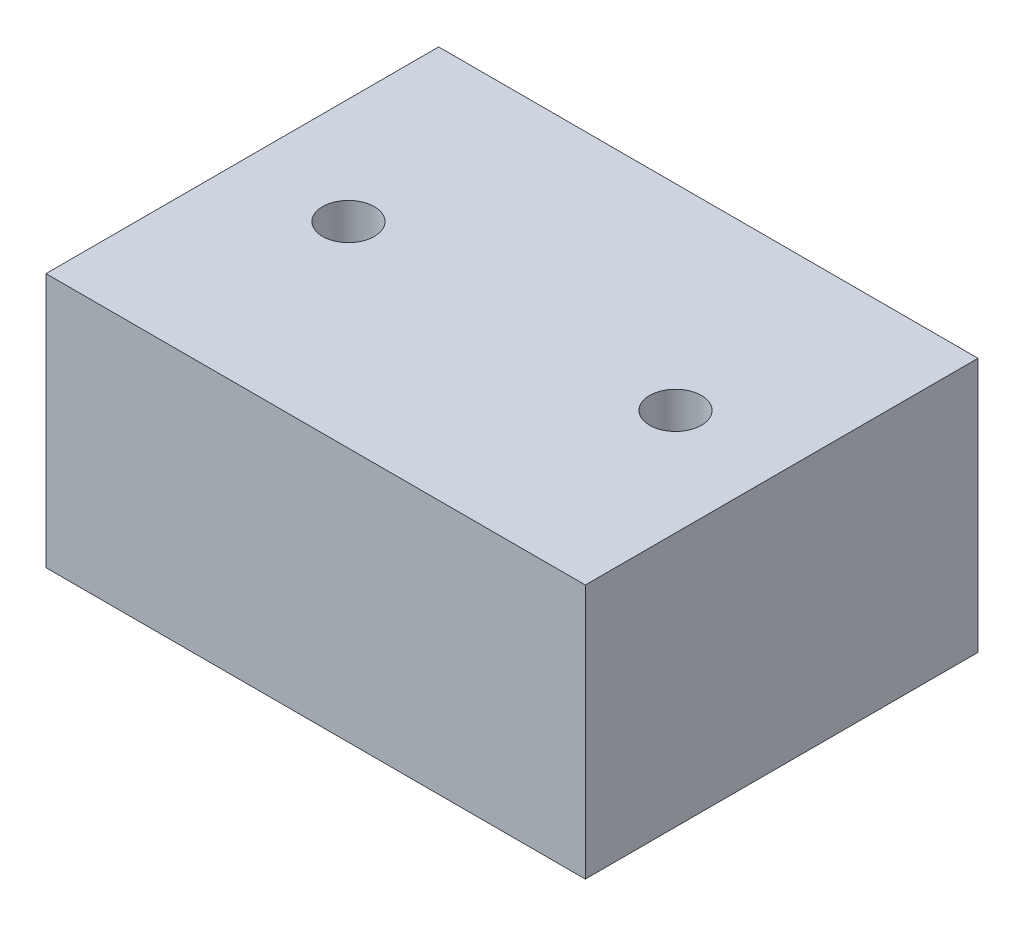
ISO-10303-21;
HEADER;
FILE_DESCRIPTION(('STEP AP214'),'2;1');
FILE_NAME('part.step','',(''),(''),'','','');
FILE_SCHEMA(('AUTOMOTIVE_DESIGN { 1 0 10303 214 1 1 1 1 }'));
ENDSEC;
DATA;
#1=APPLICATION_CONTEXT('core data for automotive mechanical design processes');
#2=APPLICATION_PROTOCOL_DEFINITION('international standard','automotive_design',2000,#1);
#3=PRODUCT_CONTEXT('',#1,'mechanical');
#4=PRODUCT('Part','Part','',(#3));
#5=PRODUCT_RELATED_PRODUCT_CATEGORY('part','',(#4));
#6=PRODUCT_DEFINITION_FORMATION('','',#4);
#7=PRODUCT_DEFINITION_CONTEXT('part definition',#1,'design');
#8=PRODUCT_DEFINITION('design','',#6,#7);
#9=PRODUCT_DEFINITION_SHAPE('','',#8);
#10=(LENGTH_UNIT() NAMED_UNIT(*) SI_UNIT(.MILLI.,.METRE.));
#11=(NAMED_UNIT(*) PLANE_ANGLE_UNIT() SI_UNIT($,.RADIAN.));
#12=(NAMED_UNIT(*) SI_UNIT($,.STERADIAN.) SOLID_ANGLE_UNIT());
#13=UNCERTAINTY_MEASURE_WITH_UNIT(LENGTH_MEASURE(1.E-05),#10,'distance_accuracy_value','');
#14=(GEOMETRIC_REPRESENTATION_CONTEXT(3) GLOBAL_UNCERTAINTY_ASSIGNED_CONTEXT((#13)) GLOBAL_UNIT_ASSIGNED_CONTEXT((#10,
#11,#12)) REPRESENTATION_CONTEXT('',''));
#15=CARTESIAN_POINT('',(0.,0.,0.));
#16=DIRECTION('',(0.,0.,1.));
#17=DIRECTION('',(1.,0.,0.));
#18=AXIS2_PLACEMENT_3D('',#15,#16,#17);
#19=CARTESIAN_POINT('',(0.,12.,0.));
#20=DIRECTION('',(1.,0.,0.));
#21=DIRECTION('',(0.,0.,-1.));
#22=AXIS2_PLACEMENT_3D('',#19,#20,#21);
#23=PLANE('',#22);
#24=DIRECTION('',(0.,0.,1.));
#25=VECTOR('',#24,1.);
#26=CARTESIAN_POINT('',(0.,0.,0.));
#27=LINE('',#26,#25);
#28=CARTESIAN_POINT('',(0.,0.,-18.5));
#29=VERTEX_POINT('',#28);
#30=CARTESIAN_POINT('',(0.,0.,0.));
#31=VERTEX_POINT('',#30);
#32=EDGE_CURVE('E149',#29,#31,#27,.T.);
#33=ORIENTED_EDGE('',*,*,#32,.T.);
#34=DIRECTION('',(0.,-1.,0.));
#35=VECTOR('',#34,1.);
#36=CARTESIAN_POINT('',(0.,12.,0.));
#37=LINE('',#36,#35);
#38=CARTESIAN_POINT('',(0.,12.,0.));
#39=VERTEX_POINT('',#38);
#40=EDGE_CURVE('E11',#39,#31,#37,.T.);
#41=ORIENTED_EDGE('',*,*,#40,.F.);
#42=DIRECTION('',(0.,0.,1.));
#43=VECTOR('',#42,1.);
#44=CARTESIAN_POINT('',(0.,12.,0.));
#45=LINE('',#44,#43);
#46=CARTESIAN_POINT('',(0.,12.,-18.5));
#47=VERTEX_POINT('',#46);
#48=EDGE_CURVE('E150',#47,#39,#45,.T.);
#49=ORIENTED_EDGE('',*,*,#48,.F.);
#50=DIRECTION('',(0.,-1.,0.));
#51=VECTOR('',#50,1.);
#52=CARTESIAN_POINT('',(0.,12.,-18.5));
#53=LINE('',#52,#51);
#54=EDGE_CURVE('E160',#47,#29,#53,.T.);
#55=ORIENTED_EDGE('',*,*,#54,.T.);
#56=EDGE_LOOP('',(#33,#41,#49,#55));
#57=FACE_BOUND('',#56,.T.);
#58=ADVANCED_FACE('F45',(#57),#23,.F.);
#59=CARTESIAN_POINT('',(0.,12.,0.));
#60=DIRECTION('',(0.,0.,-1.));
#61=DIRECTION('',(-1.,0.,0.));
#62=AXIS2_PLACEMENT_3D('',#59,#60,#61);
#63=PLANE('',#62);
#64=DIRECTION('',(1.,0.,0.));
#65=VECTOR('',#64,1.);
#66=CARTESIAN_POINT('',(0.,0.,0.));
#67=LINE('',#66,#65);
#68=CARTESIAN_POINT('',(25.41,0.,0.));
#69=VERTEX_POINT('',#68);
#70=EDGE_CURVE('E164',#31,#69,#67,.T.);
#71=ORIENTED_EDGE('',*,*,#70,.T.);
#72=DIRECTION('',(0.,-1.,0.));
#73=VECTOR('',#72,1.);
#74=CARTESIAN_POINT('',(25.41,12.,0.));
#75=LINE('',#74,#73);
#76=CARTESIAN_POINT('',(25.41,12.,0.));
#77=VERTEX_POINT('',#76);
#78=EDGE_CURVE('E54',#77,#69,#75,.T.);
#79=ORIENTED_EDGE('',*,*,#78,.F.);
#80=DIRECTION('',(1.,0.,0.));
#81=VECTOR('',#80,1.);
#82=CARTESIAN_POINT('',(0.,12.,0.));
#83=LINE('',#82,#81);
#84=EDGE_CURVE('E93',#39,#77,#83,.T.);
#85=ORIENTED_EDGE('',*,*,#84,.F.);
#86=ORIENTED_EDGE('',*,*,#40,.T.);
#87=EDGE_LOOP('',(#71,#79,#85,#86));
#88=FACE_BOUND('',#87,.T.);
#89=ADVANCED_FACE('F194',(#88),#63,.F.);
#90=CARTESIAN_POINT('',(25.41,12.,0.));
#91=DIRECTION('',(-1.,0.,0.));
#92=DIRECTION('',(0.,0.,1.));
#93=AXIS2_PLACEMENT_3D('',#90,#91,#92);
#94=PLANE('',#93);
#95=DIRECTION('',(0.,0.,-1.));
#96=VECTOR('',#95,1.);
#97=CARTESIAN_POINT('',(25.41,0.,0.));
#98=LINE('',#97,#96);
#99=CARTESIAN_POINT('',(25.41,0.,-18.5));
#100=VERTEX_POINT('',#99);
#101=EDGE_CURVE('E80',#69,#100,#98,.T.);
#102=ORIENTED_EDGE('',*,*,#101,.T.);
#103=DIRECTION('',(0.,-1.,0.));
#104=VECTOR('',#103,1.);
#105=CARTESIAN_POINT('',(25.41,12.,-18.5));
#106=LINE('',#105,#104);
#107=CARTESIAN_POINT('',(25.41,12.,-18.5));
#108=VERTEX_POINT('',#107);
#109=EDGE_CURVE('E173',#108,#100,#106,.T.);
#110=ORIENTED_EDGE('',*,*,#109,.F.);
#111=DIRECTION('',(0.,0.,-1.));
#112=VECTOR('',#111,1.);
#113=CARTESIAN_POINT('',(25.41,12.,0.));
#114=LINE('',#113,#112);
#115=EDGE_CURVE('E155',#77,#108,#114,.T.);
#116=ORIENTED_EDGE('',*,*,#115,.F.);
#117=ORIENTED_EDGE('',*,*,#78,.T.);
#118=EDGE_LOOP('',(#102,#110,#116,#117));
#119=FACE_BOUND('',#118,.T.);
#120=ADVANCED_FACE('F177',(#119),#94,.F.);
#121=CARTESIAN_POINT('',(0.,12.,-18.5));
#122=DIRECTION('',(0.,0.,1.));
#123=DIRECTION('',(1.,0.,0.));
#124=AXIS2_PLACEMENT_3D('',#121,#122,#123);
#125=PLANE('',#124);
#126=DIRECTION('',(-1.,0.,0.));
#127=VECTOR('',#126,1.);
#128=CARTESIAN_POINT('',(0.,0.,-18.5));
#129=LINE('',#128,#127);
#130=EDGE_CURVE('E86',#100,#29,#129,.T.);
#131=ORIENTED_EDGE('',*,*,#130,.T.);
#132=ORIENTED_EDGE('',*,*,#54,.F.);
#133=DIRECTION('',(-1.,0.,0.));
#134=VECTOR('',#133,1.);
#135=CARTESIAN_POINT('',(0.,12.,-18.5));
#136=LINE('',#135,#134);
#137=EDGE_CURVE('E62',#108,#47,#136,.T.);
#138=ORIENTED_EDGE('',*,*,#137,.F.);
#139=ORIENTED_EDGE('',*,*,#109,.T.);
#140=EDGE_LOOP('',(#131,#132,#138,#139));
#141=FACE_BOUND('',#140,.T.);
#142=ADVANCED_FACE('F184',(#141),#125,.F.);
#143=CARTESIAN_POINT('',(0.,12.,0.));
#144=DIRECTION('',(0.,-1.,0.));
#145=DIRECTION('',(0.,0.,-1.));
#146=AXIS2_PLACEMENT_3D('',#143,#144,#145);
#147=PLANE('',#146);
#148=CARTESIAN_POINT('',(20.41,12.,-9.25));
#149=DIRECTION('',(0.,-1.,0.));
#150=DIRECTION('',(0.,0.,-1.));
#151=AXIS2_PLACEMENT_3D('',#148,#149,#150);
#152=CIRCLE('',#151,1.2192);
#153=CARTESIAN_POINT('',(20.41,12.,-10.4692));
#154=VERTEX_POINT('',#153);
#155=EDGE_CURVE('E408',#154,#154,#152,.T.);
#156=ORIENTED_EDGE('',*,*,#155,.T.);
#157=EDGE_LOOP('',(#156));
#158=FACE_BOUND('',#157,.T.);
#159=CARTESIAN_POINT('',(5.,12.,-9.25));
#160=DIRECTION('',(0.,-1.,0.));
#161=DIRECTION('',(0.,0.,-1.));
#162=AXIS2_PLACEMENT_3D('',#159,#160,#161);
#163=CIRCLE('',#162,1.2192);
#164=CARTESIAN_POINT('',(5.,12.,-10.4692));
#165=VERTEX_POINT('',#164);
#166=EDGE_CURVE('E424',#165,#165,#163,.T.);
#167=ORIENTED_EDGE('',*,*,#166,.T.);
#168=EDGE_LOOP('',(#167));
#169=FACE_BOUND('',#168,.T.);
#170=ORIENTED_EDGE('',*,*,#48,.T.);
#171=ORIENTED_EDGE('',*,*,#84,.T.);
#172=ORIENTED_EDGE('',*,*,#115,.T.);
#173=ORIENTED_EDGE('',*,*,#137,.T.);
#174=EDGE_LOOP('',(#170,#171,#172,#173));
#175=FACE_BOUND('',#174,.T.);
#176=ADVANCED_FACE('F186',(#158,#169,#175),#147,.F.);
#177=CARTESIAN_POINT('',(0.,0.,0.));
#178=DIRECTION('',(0.,-1.,0.));
#179=DIRECTION('',(0.,0.,-1.));
#180=AXIS2_PLACEMENT_3D('',#177,#178,#179);
#181=PLANE('',#180);
#182=CARTESIAN_POINT('',(20.41,0.,-9.25));
#183=DIRECTION('',(0.,-1.,0.));
#184=DIRECTION('',(0.,0.,-1.));
#185=AXIS2_PLACEMENT_3D('',#182,#183,#184);
#186=CIRCLE('',#185,2.77875999999999);
#187=CARTESIAN_POINT('',(20.41,0.,-12.02876));
#188=VERTEX_POINT('',#187);
#189=EDGE_CURVE('E398',#188,#188,#186,.T.);
#190=ORIENTED_EDGE('',*,*,#189,.F.);
#191=EDGE_LOOP('',(#190));
#192=FACE_BOUND('',#191,.T.);
#193=CARTESIAN_POINT('',(5.,0.,-9.25));
#194=DIRECTION('',(0.,-1.,0.));
#195=DIRECTION('',(0.,0.,-1.));
#196=AXIS2_PLACEMENT_3D('',#193,#194,#195);
#197=CIRCLE('',#196,2.77875999999999);
#198=CARTESIAN_POINT('',(5.,0.,-12.02876));
#199=VERTEX_POINT('',#198);
#200=EDGE_CURVE('E412',#199,#199,#197,.T.);
#201=ORIENTED_EDGE('',*,*,#200,.F.);
#202=EDGE_LOOP('',(#201));
#203=FACE_BOUND('',#202,.T.);
#204=CARTESIAN_POINT('',(12.705,0.,-9.25));
#205=DIRECTION('',(0.,-1.,0.));
#206=DIRECTION('',(0.,0.,-1.));
#207=AXIS2_PLACEMENT_3D('',#204,#205,#206);
#208=CIRCLE('',#207,3.);
#209=CARTESIAN_POINT('',(12.705,0.,-12.25));
#210=VERTEX_POINT('',#209);
#211=EDGE_CURVE('E428',#210,#210,#208,.T.);
#212=ORIENTED_EDGE('',*,*,#211,.F.);
#213=EDGE_LOOP('',(#212));
#214=FACE_BOUND('',#213,.T.);
#215=CARTESIAN_POINT('',(23.91,0.,-17.));
#216=DIRECTION('',(0.,-1.,0.));
#217=DIRECTION('',(0.,0.,-1.));
#218=AXIS2_PLACEMENT_3D('',#215,#216,#217);
#219=CIRCLE('',#218,0.88899999999999);
#220=CARTESIAN_POINT('',(23.91,0.,-17.889));
#221=VERTEX_POINT('',#220);
#222=EDGE_CURVE('E118',#221,#221,#219,.T.);
#223=ORIENTED_EDGE('',*,*,#222,.F.);
#224=EDGE_LOOP('',(#223));
#225=FACE_BOUND('',#224,.T.);
#226=CARTESIAN_POINT('',(23.91,0.,-1.5));
#227=DIRECTION('',(0.,-1.,0.));
#228=DIRECTION('',(0.,0.,-1.));
#229=AXIS2_PLACEMENT_3D('',#226,#227,#228);
#230=CIRCLE('',#229,0.88899999999999);
#231=CARTESIAN_POINT('',(23.91,0.,-2.38899999999999));
#232=VERTEX_POINT('',#231);
#233=EDGE_CURVE('E117',#232,#232,#230,.T.);
#234=ORIENTED_EDGE('',*,*,#233,.F.);
#235=EDGE_LOOP('',(#234));
#236=FACE_BOUND('',#235,.T.);
#237=CARTESIAN_POINT('',(1.5,0.,-1.5));
#238=DIRECTION('',(0.,-1.,0.));
#239=DIRECTION('',(0.,0.,-1.));
#240=AXIS2_PLACEMENT_3D('',#237,#238,#239);
#241=CIRCLE('',#240,0.888999999999989);
#242=CARTESIAN_POINT('',(1.5,0.,-2.38899999999999));
#243=VERTEX_POINT('',#242);
#244=EDGE_CURVE('E133',#243,#243,#241,.T.);
#245=ORIENTED_EDGE('',*,*,#244,.F.);
#246=EDGE_LOOP('',(#245));
#247=FACE_BOUND('',#246,.T.);
#248=CARTESIAN_POINT('',(1.5,0.,-17.));
#249=DIRECTION('',(0.,-1.,0.));
#250=DIRECTION('',(0.,0.,-1.));
#251=AXIS2_PLACEMENT_3D('',#248,#249,#250);
#252=CIRCLE('',#251,0.888999999999989);
#253=CARTESIAN_POINT('',(1.5,0.,-17.889));
#254=VERTEX_POINT('',#253);
#255=EDGE_CURVE('E141',#254,#254,#252,.T.);
#256=ORIENTED_EDGE('',*,*,#255,.F.);
#257=EDGE_LOOP('',(#256));
#258=FACE_BOUND('',#257,.T.);
#259=ORIENTED_EDGE('',*,*,#32,.F.);
#260=ORIENTED_EDGE('',*,*,#130,.F.);
#261=ORIENTED_EDGE('',*,*,#101,.F.);
#262=ORIENTED_EDGE('',*,*,#70,.F.);
#263=EDGE_LOOP('',(#259,#260,#261,#262));
#264=FACE_BOUND('',#263,.T.);
#265=ADVANCED_FACE('F180',(#192,#203,#214,#225,#236,#247,#258,#264),#181,.T.);
#266=CARTESIAN_POINT('',(1.5,7.4658349096845,-17.));
#267=DIRECTION('',(0.,-1.,0.));
#268=DIRECTION('',(0.,0.,-1.));
#269=AXIS2_PLACEMENT_3D('',#266,#267,#268);
#270=CONICAL_SURFACE('',#269,0.888999999999999,1.02974425867665);
#271=CARTESIAN_POINT('',(1.5,8.,-17.));
#272=VERTEX_POINT('',#271);
#273=VERTEX_LOOP('',#272);
#274=FACE_BOUND('',#273,.T.);
#275=CARTESIAN_POINT('',(1.5,7.4658349096845,-17.));
#276=DIRECTION('',(0.,-1.,0.));
#277=DIRECTION('',(0.,0.,-1.));
#278=AXIS2_PLACEMENT_3D('',#275,#276,#277);
#279=CIRCLE('',#278,0.888999999999999);
#280=CARTESIAN_POINT('',(1.5,7.4658349096845,-17.889));
#281=VERTEX_POINT('',#280);
#282=EDGE_CURVE('E145',#281,#281,#279,.T.);
#283=ORIENTED_EDGE('',*,*,#282,.T.);
#284=EDGE_LOOP('',(#283));
#285=FACE_BOUND('',#284,.T.);
#286=ADVANCED_FACE('F217',(#274,#285),#270,.F.);
#287=CARTESIAN_POINT('',(1.5,0.,-17.));
#288=DIRECTION('',(0.,-1.,0.));
#289=DIRECTION('',(0.,0.,-1.));
#290=AXIS2_PLACEMENT_3D('',#287,#288,#289);
#291=CYLINDRICAL_SURFACE('',#290,0.888999999999994);
#292=ORIENTED_EDGE('',*,*,#282,.F.);
#293=EDGE_LOOP('',(#292));
#294=FACE_BOUND('',#293,.T.);
#295=ORIENTED_EDGE('',*,*,#255,.T.);
#296=EDGE_LOOP('',(#295));
#297=FACE_BOUND('',#296,.T.);
#298=ADVANCED_FACE('F222',(#294,#297),#291,.F.);
#299=CARTESIAN_POINT('',(1.5,7.4658349096845,-1.5));
#300=DIRECTION('',(0.,-1.,0.));
#301=DIRECTION('',(0.,0.,-1.));
#302=AXIS2_PLACEMENT_3D('',#299,#300,#301);
#303=CONICAL_SURFACE('',#302,0.888999999999998,1.02974425867665);
#304=CARTESIAN_POINT('',(1.5,8.,-1.5));
#305=VERTEX_POINT('',#304);
#306=VERTEX_LOOP('',#305);
#307=FACE_BOUND('',#306,.T.);
#308=CARTESIAN_POINT('',(1.5,7.4658349096845,-1.5));
#309=DIRECTION('',(0.,-1.,0.));
#310=DIRECTION('',(0.,0.,-1.));
#311=AXIS2_PLACEMENT_3D('',#308,#309,#310);
#312=CIRCLE('',#311,0.888999999999998);
#313=CARTESIAN_POINT('',(1.5,7.4658349096845,-2.389));
#314=VERTEX_POINT('',#313);
#315=EDGE_CURVE('E137',#314,#314,#312,.T.);
#316=ORIENTED_EDGE('',*,*,#315,.T.);
#317=EDGE_LOOP('',(#316));
#318=FACE_BOUND('',#317,.T.);
#319=ADVANCED_FACE('F235',(#307,#318),#303,.F.);
#320=CARTESIAN_POINT('',(1.5,0.,-1.5));
#321=DIRECTION('',(0.,-1.,0.));
#322=DIRECTION('',(0.,0.,-1.));
#323=AXIS2_PLACEMENT_3D('',#320,#321,#322);
#324=CYLINDRICAL_SURFACE('',#323,0.888999999999994);
#325=ORIENTED_EDGE('',*,*,#315,.F.);
#326=EDGE_LOOP('',(#325));
#327=FACE_BOUND('',#326,.T.);
#328=ORIENTED_EDGE('',*,*,#244,.T.);
#329=EDGE_LOOP('',(#328));
#330=FACE_BOUND('',#329,.T.);
#331=ADVANCED_FACE('F247',(#327,#330),#324,.F.);
#332=CARTESIAN_POINT('',(23.91,7.4658349096845,-1.5));
#333=DIRECTION('',(0.,-1.,0.));
#334=DIRECTION('',(0.,0.,-1.));
#335=AXIS2_PLACEMENT_3D('',#332,#333,#334);
#336=CONICAL_SURFACE('',#335,0.888999999999997,1.02974425867665);
#337=CARTESIAN_POINT('',(23.91,8.,-1.5));
#338=VERTEX_POINT('',#337);
#339=VERTEX_LOOP('',#338);
#340=FACE_BOUND('',#339,.T.);
#341=CARTESIAN_POINT('',(23.91,7.4658349096845,-1.5));
#342=DIRECTION('',(0.,-1.,0.));
#343=DIRECTION('',(0.,0.,-1.));
#344=AXIS2_PLACEMENT_3D('',#341,#342,#343);
#345=CIRCLE('',#344,0.888999999999997);
#346=CARTESIAN_POINT('',(23.91,7.4658349096845,-2.389));
#347=VERTEX_POINT('',#346);
#348=EDGE_CURVE('E123',#347,#347,#345,.T.);
#349=ORIENTED_EDGE('',*,*,#348,.T.);
#350=EDGE_LOOP('',(#349));
#351=FACE_BOUND('',#350,.T.);
#352=ADVANCED_FACE('F257',(#340,#351),#336,.F.);
#353=CARTESIAN_POINT('',(23.91,0.,-1.5));
#354=DIRECTION('',(0.,-1.,0.));
#355=DIRECTION('',(0.,0.,-1.));
#356=AXIS2_PLACEMENT_3D('',#353,#354,#355);
#357=CYLINDRICAL_SURFACE('',#356,0.888999999999994);
#358=ORIENTED_EDGE('',*,*,#348,.F.);
#359=EDGE_LOOP('',(#358));
#360=FACE_BOUND('',#359,.T.);
#361=ORIENTED_EDGE('',*,*,#233,.T.);
#362=EDGE_LOOP('',(#361));
#363=FACE_BOUND('',#362,.T.);
#364=ADVANCED_FACE('F110',(#360,#363),#357,.F.);
#365=CARTESIAN_POINT('',(23.91,7.4658349096845,-17.));
#366=DIRECTION('',(0.,-1.,0.));
#367=DIRECTION('',(0.,0.,-1.));
#368=AXIS2_PLACEMENT_3D('',#365,#366,#367);
#369=CONICAL_SURFACE('',#368,0.888999999999997,1.02974425867665);
#370=CARTESIAN_POINT('',(23.91,8.,-17.));
#371=VERTEX_POINT('',#370);
#372=VERTEX_LOOP('',#371);
#373=FACE_BOUND('',#372,.T.);
#374=CARTESIAN_POINT('',(23.91,7.4658349096845,-17.));
#375=DIRECTION('',(0.,-1.,0.));
#376=DIRECTION('',(0.,0.,-1.));
#377=AXIS2_PLACEMENT_3D('',#374,#375,#376);
#378=CIRCLE('',#377,0.888999999999997);
#379=CARTESIAN_POINT('',(23.91,7.4658349096845,-17.889));
#380=VERTEX_POINT('',#379);
#381=EDGE_CURVE('E114',#380,#380,#378,.T.);
#382=ORIENTED_EDGE('',*,*,#381,.T.);
#383=EDGE_LOOP('',(#382));
#384=FACE_BOUND('',#383,.T.);
#385=ADVANCED_FACE('F106',(#373,#384),#369,.F.);
#386=CARTESIAN_POINT('',(23.91,0.,-17.));
#387=DIRECTION('',(0.,-1.,0.));
#388=DIRECTION('',(0.,0.,-1.));
#389=AXIS2_PLACEMENT_3D('',#386,#387,#388);
#390=CYLINDRICAL_SURFACE('',#389,0.888999999999994);
#391=ORIENTED_EDGE('',*,*,#381,.F.);
#392=EDGE_LOOP('',(#391));
#393=FACE_BOUND('',#392,.T.);
#394=ORIENTED_EDGE('',*,*,#222,.T.);
#395=EDGE_LOOP('',(#394));
#396=FACE_BOUND('',#395,.T.);
#397=ADVANCED_FACE('F109',(#393,#396),#390,.F.);
#398=CARTESIAN_POINT('',(12.705,3.,-9.25));
#399=DIRECTION('',(0.,-1.,0.));
#400=DIRECTION('',(0.,0.,-1.));
#401=AXIS2_PLACEMENT_3D('',#398,#399,#400);
#402=CYLINDRICAL_SURFACE('',#401,3.);
#403=CARTESIAN_POINT('',(12.705,3.,-9.25));
#404=DIRECTION('',(0.,-1.,0.));
#405=DIRECTION('',(0.,0.,-1.));
#406=AXIS2_PLACEMENT_3D('',#403,#404,#405);
#407=CIRCLE('',#406,3.);
#408=CARTESIAN_POINT('',(12.705,3.,-12.25));
#409=VERTEX_POINT('',#408);
#410=EDGE_CURVE('E126',#409,#409,#407,.T.);
#411=ORIENTED_EDGE('',*,*,#410,.F.);
#412=EDGE_LOOP('',(#411));
#413=FACE_BOUND('',#412,.T.);
#414=ORIENTED_EDGE('',*,*,#211,.T.);
#415=EDGE_LOOP('',(#414));
#416=FACE_BOUND('',#415,.T.);
#417=ADVANCED_FACE('F295',(#413,#416),#402,.F.);
#418=CARTESIAN_POINT('',(12.705,3.,-9.25));
#419=DIRECTION('',(0.,-1.,0.));
#420=DIRECTION('',(0.,0.,-1.));
#421=AXIS2_PLACEMENT_3D('',#418,#419,#420);
#422=PLANE('',#421);
#423=ORIENTED_EDGE('',*,*,#410,.T.);
#424=EDGE_LOOP('',(#423));
#425=FACE_BOUND('',#424,.T.);
#426=ADVANCED_FACE('F305',(#425),#422,.T.);
#427=CARTESIAN_POINT('',(5.,0.,-9.25));
#428=DIRECTION('',(0.,-1.,0.));
#429=DIRECTION('',(0.,0.,-1.));
#430=AXIS2_PLACEMENT_3D('',#427,#428,#429);
#431=CYLINDRICAL_SURFACE('',#430,1.2192);
#432=ORIENTED_EDGE('',*,*,#166,.F.);
#433=EDGE_LOOP('',(#432));
#434=FACE_BOUND('',#433,.T.);
#435=CARTESIAN_POINT('',(5.,7.269988,-9.25));
#436=DIRECTION('',(0.,-1.,0.));
#437=DIRECTION('',(0.,0.,-1.));
#438=AXIS2_PLACEMENT_3D('',#435,#436,#437);
#439=CIRCLE('',#438,1.2192);
#440=CARTESIAN_POINT('',(5.,7.269988,-10.4692));
#441=VERTEX_POINT('',#440);
#442=EDGE_CURVE('E420',#441,#441,#439,.T.);
#443=ORIENTED_EDGE('',*,*,#442,.T.);
#444=EDGE_LOOP('',(#443));
#445=FACE_BOUND('',#444,.T.);
#446=ADVANCED_FACE('F315',(#434,#445),#431,.F.);
#447=CARTESIAN_POINT('',(6.2192,7.269988,-9.25));
#448=DIRECTION('',(0.,1.,0.));
#449=DIRECTION('',(0.,0.,1.));
#450=AXIS2_PLACEMENT_3D('',#447,#448,#449);
#451=PLANE('',#450);
#452=ORIENTED_EDGE('',*,*,#442,.F.);
#453=EDGE_LOOP('',(#452));
#454=FACE_BOUND('',#453,.T.);
#455=CARTESIAN_POINT('',(5.,7.269988,-9.25));
#456=DIRECTION('',(0.,-1.,0.));
#457=DIRECTION('',(0.,0.,-1.));
#458=AXIS2_PLACEMENT_3D('',#455,#456,#457);
#459=CIRCLE('',#458,2.77876);
#460=CARTESIAN_POINT('',(5.,7.269988,-12.02876));
#461=VERTEX_POINT('',#460);
#462=EDGE_CURVE('E416',#461,#461,#459,.T.);
#463=ORIENTED_EDGE('',*,*,#462,.T.);
#464=EDGE_LOOP('',(#463));
#465=FACE_BOUND('',#464,.T.);
#466=ADVANCED_FACE('F338',(#454,#465),#451,.F.);
#467=CARTESIAN_POINT('',(5.,0.,-9.25));
#468=DIRECTION('',(0.,-1.,0.));
#469=DIRECTION('',(0.,0.,-1.));
#470=AXIS2_PLACEMENT_3D('',#467,#468,#469);
#471=CYLINDRICAL_SURFACE('',#470,2.77876);
#472=ORIENTED_EDGE('',*,*,#462,.F.);
#473=EDGE_LOOP('',(#472));
#474=FACE_BOUND('',#473,.T.);
#475=ORIENTED_EDGE('',*,*,#200,.T.);
#476=EDGE_LOOP('',(#475));
#477=FACE_BOUND('',#476,.T.);
#478=ADVANCED_FACE('F348',(#474,#477),#471,.F.);
#479=CARTESIAN_POINT('',(20.41,0.,-9.25));
#480=DIRECTION('',(0.,-1.,0.));
#481=DIRECTION('',(0.,0.,-1.));
#482=AXIS2_PLACEMENT_3D('',#479,#480,#481);
#483=CYLINDRICAL_SURFACE('',#482,1.2192);
#484=ORIENTED_EDGE('',*,*,#155,.F.);
#485=EDGE_LOOP('',(#484));
#486=FACE_BOUND('',#485,.T.);
#487=CARTESIAN_POINT('',(20.41,7.269988,-9.25));
#488=DIRECTION('',(0.,-1.,0.));
#489=DIRECTION('',(0.,0.,-1.));
#490=AXIS2_PLACEMENT_3D('',#487,#488,#489);
#491=CIRCLE('',#490,1.2192);
#492=CARTESIAN_POINT('',(20.41,7.269988,-10.4692));
#493=VERTEX_POINT('',#492);
#494=EDGE_CURVE('E402',#493,#493,#491,.T.);
#495=ORIENTED_EDGE('',*,*,#494,.T.);
#496=EDGE_LOOP('',(#495));
#497=FACE_BOUND('',#496,.T.);
#498=ADVANCED_FACE('F358',(#486,#497),#483,.F.);
#499=CARTESIAN_POINT('',(21.6292,7.269988,-9.25));
#500=DIRECTION('',(0.,1.,0.));
#501=DIRECTION('',(0.,0.,1.));
#502=AXIS2_PLACEMENT_3D('',#499,#500,#501);
#503=PLANE('',#502);
#504=ORIENTED_EDGE('',*,*,#494,.F.);
#505=EDGE_LOOP('',(#504));
#506=FACE_BOUND('',#505,.T.);
#507=CARTESIAN_POINT('',(20.41,7.269988,-9.25));
#508=DIRECTION('',(0.,-1.,0.));
#509=DIRECTION('',(0.,0.,-1.));
#510=AXIS2_PLACEMENT_3D('',#507,#508,#509);
#511=CIRCLE('',#510,2.77876);
#512=CARTESIAN_POINT('',(20.41,7.269988,-12.02876));
#513=VERTEX_POINT('',#512);
#514=EDGE_CURVE('E395',#513,#513,#511,.T.);
#515=ORIENTED_EDGE('',*,*,#514,.T.);
#516=EDGE_LOOP('',(#515));
#517=FACE_BOUND('',#516,.T.);
#518=ADVANCED_FACE('F368',(#506,#517),#503,.F.);
#519=CARTESIAN_POINT('',(20.41,0.,-9.25));
#520=DIRECTION('',(0.,-1.,0.));
#521=DIRECTION('',(0.,0.,-1.));
#522=AXIS2_PLACEMENT_3D('',#519,#520,#521);
#523=CYLINDRICAL_SURFACE('',#522,2.77876);
#524=ORIENTED_EDGE('',*,*,#514,.F.);
#525=EDGE_LOOP('',(#524));
#526=FACE_BOUND('',#525,.T.);
#527=ORIENTED_EDGE('',*,*,#189,.T.);
#528=EDGE_LOOP('',(#527));
#529=FACE_BOUND('',#528,.T.);
#530=ADVANCED_FACE('F378',(#526,#529),#523,.F.);
#531=CLOSED_SHELL('',(#58,#89,#120,#142,#176,#265,#286,#298,#319,#331,#352,#364,#385,#397,#417,
#426,#446,#466,#478,#498,#518,#530));
#532=MANIFOLD_SOLID_BREP('B2',#531);
#533=ADVANCED_BREP_SHAPE_REPRESENTATION('',(#18,#532),#14);
#534=SHAPE_DEFINITION_REPRESENTATION(#9,#533);
ENDSEC;
END-ISO-10303-21;
